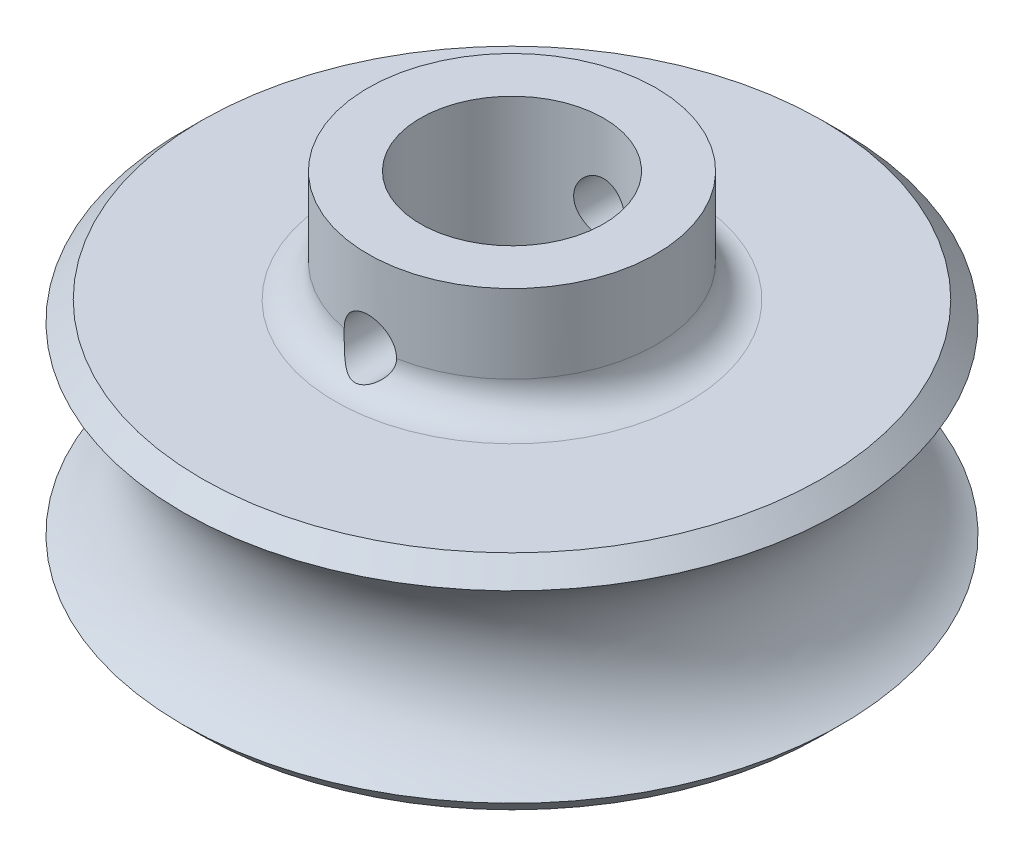
ISO-10303-21;
HEADER;
FILE_DESCRIPTION(('STEP AP214'),'2;1');
FILE_NAME('part.step','',(''),(''),'','','');
FILE_SCHEMA(('AUTOMOTIVE_DESIGN { 1 0 10303 214 1 1 1 1 }'));
ENDSEC;
DATA;
#1=APPLICATION_CONTEXT('core data for automotive mechanical design processes');
#2=APPLICATION_PROTOCOL_DEFINITION('international standard','automotive_design',2000,#1);
#3=PRODUCT_CONTEXT('',#1,'mechanical');
#4=PRODUCT('Part','Part','',(#3));
#5=PRODUCT_RELATED_PRODUCT_CATEGORY('part','',(#4));
#6=PRODUCT_DEFINITION_FORMATION('','',#4);
#7=PRODUCT_DEFINITION_CONTEXT('part definition',#1,'design');
#8=PRODUCT_DEFINITION('design','',#6,#7);
#9=PRODUCT_DEFINITION_SHAPE('','',#8);
#10=(LENGTH_UNIT() NAMED_UNIT(*) SI_UNIT(.MILLI.,.METRE.));
#11=(NAMED_UNIT(*) PLANE_ANGLE_UNIT() SI_UNIT($,.RADIAN.));
#12=(NAMED_UNIT(*) SI_UNIT($,.STERADIAN.) SOLID_ANGLE_UNIT());
#13=UNCERTAINTY_MEASURE_WITH_UNIT(LENGTH_MEASURE(1.E-05),#10,'distance_accuracy_value','');
#14=(GEOMETRIC_REPRESENTATION_CONTEXT(3) GLOBAL_UNCERTAINTY_ASSIGNED_CONTEXT((#13)) GLOBAL_UNIT_ASSIGNED_CONTEXT((#10,
#11,#12)) REPRESENTATION_CONTEXT('',''));
#15=CARTESIAN_POINT('',(0.,0.,0.));
#16=DIRECTION('',(0.,0.,1.));
#17=DIRECTION('',(1.,0.,0.));
#18=AXIS2_PLACEMENT_3D('',#15,#16,#17);
#19=CARTESIAN_POINT('',(0.,0.,0.));
#20=DIRECTION('',(0.,-1.,0.));
#21=DIRECTION('',(0.,0.,-1.));
#22=AXIS2_PLACEMENT_3D('',#19,#20,#21);
#23=CYLINDRICAL_SURFACE('',#22,5.5);
#24=CARTESIAN_POINT('',(0.,12.75,0.));
#25=DIRECTION('',(0.,-1.,0.));
#26=DIRECTION('',(0.,0.,-1.));
#27=AXIS2_PLACEMENT_3D('',#24,#25,#26);
#28=CIRCLE('',#27,5.5);
#29=CARTESIAN_POINT('',(0.,12.75,-5.5));
#30=VERTEX_POINT('',#29);
#31=EDGE_CURVE('E47',#30,#30,#28,.T.);
#32=ORIENTED_EDGE('',*,*,#31,.T.);
#33=EDGE_LOOP('',(#32));
#34=FACE_BOUND('',#33,.T.);
#35=CARTESIAN_POINT('',(0.,9.75,0.));
#36=DIRECTION('',(0.,-1.,0.));
#37=DIRECTION('',(0.,0.,-1.));
#38=AXIS2_PLACEMENT_3D('',#35,#36,#37);
#39=CIRCLE('',#38,5.5);
#40=CARTESIAN_POINT('',(-0.999999999999999,9.75,5.40832691319598));
#41=VERTEX_POINT('',#40);
#42=CARTESIAN_POINT('',(-0.999999999999999,9.75,-5.40832691319598));
#43=VERTEX_POINT('',#42);
#44=EDGE_CURVE('E76',#41,#43,#39,.T.);
#45=ORIENTED_EDGE('',*,*,#44,.F.);
#46=CARTESIAN_POINT('',(0.999999999999999,9.75,5.40832691319598));
#47=CARTESIAN_POINT('',(1.00000009030817,9.7778859691048,5.40832562945698));
#48=CARTESIAN_POINT('',(0.998832820946866,9.80575834618115,5.40854286286805));
#49=CARTESIAN_POINT('',(0.994177925583233,9.86129902142505,5.40940094202984));
#50=CARTESIAN_POINT('',(0.990690555387388,9.88896734175121,5.41004174107959));
#51=CARTESIAN_POINT('',(0.976790488966184,9.97128555123954,5.41257559602071));
#52=CARTESIAN_POINT('',(0.962939684533751,10.0253767122106,5.41508022958945));
#53=CARTESIAN_POINT('',(0.926487701794503,10.1304160550125,5.42143508439629));
#54=CARTESIAN_POINT('',(0.903885013221132,10.1813636926218,5.42528553786427));
#55=CARTESIAN_POINT('',(0.850586549646126,10.2787558493883,5.43389626993413));
#56=CARTESIAN_POINT('',(0.819890351555226,10.3252001329583,5.43865659609615));
#57=CARTESIAN_POINT('',(0.750899154166051,10.4127904453349,5.44861213323576));
#58=CARTESIAN_POINT('',(0.712528634809448,10.4538765174608,5.45381134309448));
#59=CARTESIAN_POINT('',(0.629436745081806,10.5290695096141,5.46402401553731));
#60=CARTESIAN_POINT('',(0.584714398987666,10.5631753554196,5.46903744943435));
#61=CARTESIAN_POINT('',(0.48979537229634,10.6236645615478,5.47835625022638));
#62=CARTESIAN_POINT('',(0.439561930413595,10.6499911219171,5.48265631328071));
#63=CARTESIAN_POINT('',(0.33529686378848,10.6938076331656,5.49001855891895));
#64=CARTESIAN_POINT('',(0.281265745511585,10.7112987598178,5.49308090620072));
#65=CARTESIAN_POINT('',(0.171563063423996,10.7367634703914,5.49759452627017));
#66=CARTESIAN_POINT('',(0.115915877404761,10.7448389684896,5.4990630383731));
#67=CARTESIAN_POINT('',(0.00403706229226314,10.7515606138362,5.50028291001906));
#68=CARTESIAN_POINT('',(-0.0521945334333451,10.7502072965141,5.50003436706766));
#69=CARTESIAN_POINT('',(-0.162944786135762,10.7381879100026,5.49786158911529));
#70=CARTESIAN_POINT('',(-0.217475821363168,10.7276318051556,5.49595714127181));
#71=CARTESIAN_POINT('',(-0.323979098662815,10.6976802655488,5.490708711934));
#72=CARTESIAN_POINT('',(-0.375951268964637,10.6782845830149,5.48736469008846));
#73=CARTESIAN_POINT('',(-0.476183992817319,10.6310980703766,5.47957953321069));
#74=CARTESIAN_POINT('',(-0.524423136915048,10.6032627572284,5.47513260824331));
#75=CARTESIAN_POINT('',(-0.615585330468304,10.5400207528066,5.46563430711896));
#76=CARTESIAN_POINT('',(-0.658508056312163,10.5046136009907,5.46058289420343));
#77=CARTESIAN_POINT('',(-0.738466817295126,10.4266312526263,5.45035022903729));
#78=CARTESIAN_POINT('',(-0.775409845186553,10.3839607499278,5.44516815315131));
#79=CARTESIAN_POINT('',(-0.841638518257556,10.2929651568329,5.43532607241293));
#80=CARTESIAN_POINT('',(-0.870922010956508,10.2446384824515,5.43066621452392));
#81=CARTESIAN_POINT('',(-0.921025025671926,10.1435764914649,5.42239445202536));
#82=CARTESIAN_POINT('',(-0.941826778019894,10.0908321953837,5.41878475203273));
#83=CARTESIAN_POINT('',(-0.974218657398865,9.98255241783262,5.41305580601168));
#84=CARTESIAN_POINT('',(-0.985822528827961,9.92702123335838,5.41093433666704));
#85=CARTESIAN_POINT('',(-0.995105265660945,9.85088182929173,5.4092299618207));
#86=CARTESIAN_POINT('',(-0.996941503261692,9.83073292336642,5.40889165044322));
#87=CARTESIAN_POINT('',(-0.999387297285128,9.79039232218674,5.40844033701008));
#88=CARTESIAN_POINT('',(-0.999998914525635,9.77020075615565,5.40832695643891));
#89=CARTESIAN_POINT('',(-0.999999999999999,9.75,5.40832691319598));
#90=B_SPLINE_CURVE_WITH_KNOTS('',3,(#46,#47,#48,#49,#50,#51,#52,#53,#54,#55,#56,#57,#58,#59,#60,
#61,#62,#63,#64,#65,#66,#67,#68,#69,#70,#71,#72,#73,#74,#75,#76,#77,#78,#79,#80,#81,#82,#83,#84,
#85,#86,#87,#88,#89),.UNSPECIFIED.,.F.,.F.,(4,2,2,2,2,2,2,2,2,2,2,2,2,2,2,2,2,2,2,2,2,4),(0.,
0.0836057779088231,0.167202339254223,0.334016345348504,0.500859150495633,0.66771067910196,
0.836292972456956,1.00490119030739,1.17471168326826,1.3444995727854,1.51243210795578,
1.68035510690119,1.84629867319202,2.01224689117921,2.17908544866572,2.34593415666996,
2.51516998087252,2.68445331271104,2.85408950147355,3.02347172239175,3.08414827484879,
3.14472263337444),.UNSPECIFIED.);
#91=CARTESIAN_POINT('',(0.999999999999999,9.75,5.40832691319598));
#92=VERTEX_POINT('',#91);
#93=EDGE_CURVE('E53',#92,#41,#90,.T.);
#94=ORIENTED_EDGE('',*,*,#93,.F.);
#95=CARTESIAN_POINT('',(0.999999999999999,9.75,-5.40832691319598));
#96=VERTEX_POINT('',#95);
#97=EDGE_CURVE('E77',#96,#92,#39,.T.);
#98=ORIENTED_EDGE('',*,*,#97,.F.);
#99=CARTESIAN_POINT('',(0.999999999999999,9.75,-5.40832691319598));
#100=CARTESIAN_POINT('',(1.00000009030817,9.7778859691048,-5.40832562945698));
#101=CARTESIAN_POINT('',(0.998832820946866,9.80575834618115,-5.40854286286805));
#102=CARTESIAN_POINT('',(0.994177925583233,9.86129902142505,-5.40940094202984));
#103=CARTESIAN_POINT('',(0.990690555387388,9.88896734175121,-5.41004174107959));
#104=CARTESIAN_POINT('',(0.976790488966184,9.97128555123954,-5.41257559602071));
#105=CARTESIAN_POINT('',(0.962939684533751,10.0253767122106,-5.41508022958945));
#106=CARTESIAN_POINT('',(0.926487701794503,10.1304160550125,-5.42143508439629));
#107=CARTESIAN_POINT('',(0.903885013221132,10.1813636926218,-5.42528553786427));
#108=CARTESIAN_POINT('',(0.850586549646126,10.2787558493883,-5.43389626993413));
#109=CARTESIAN_POINT('',(0.819890351555226,10.3252001329583,-5.43865659609615));
#110=CARTESIAN_POINT('',(0.750899154166051,10.4127904453349,-5.44861213323576));
#111=CARTESIAN_POINT('',(0.712528634809448,10.4538765174608,-5.45381134309448));
#112=CARTESIAN_POINT('',(0.629436745081806,10.5290695096141,-5.46402401553731));
#113=CARTESIAN_POINT('',(0.584714398987666,10.5631753554196,-5.46903744943435));
#114=CARTESIAN_POINT('',(0.48979537229634,10.6236645615478,-5.47835625022638));
#115=CARTESIAN_POINT('',(0.439561930413595,10.6499911219171,-5.48265631328071));
#116=CARTESIAN_POINT('',(0.33529686378848,10.6938076331656,-5.49001855891895));
#117=CARTESIAN_POINT('',(0.281265745511585,10.7112987598178,-5.49308090620072));
#118=CARTESIAN_POINT('',(0.171563063423996,10.7367634703914,-5.49759452627017));
#119=CARTESIAN_POINT('',(0.115915877404761,10.7448389684896,-5.4990630383731));
#120=CARTESIAN_POINT('',(0.00403706229226314,10.7515606138362,-5.50028291001906));
#121=CARTESIAN_POINT('',(-0.0521945334333451,10.7502072965141,-5.50003436706766));
#122=CARTESIAN_POINT('',(-0.162944786135762,10.7381879100026,-5.49786158911529));
#123=CARTESIAN_POINT('',(-0.217475821363168,10.7276318051556,-5.49595714127181));
#124=CARTESIAN_POINT('',(-0.323979098662815,10.6976802655488,-5.490708711934));
#125=CARTESIAN_POINT('',(-0.375951268964637,10.6782845830149,-5.48736469008846));
#126=CARTESIAN_POINT('',(-0.476183992817319,10.6310980703766,-5.47957953321069));
#127=CARTESIAN_POINT('',(-0.524423136915048,10.6032627572284,-5.47513260824331));
#128=CARTESIAN_POINT('',(-0.615585330468304,10.5400207528066,-5.46563430711896));
#129=CARTESIAN_POINT('',(-0.658508056312163,10.5046136009907,-5.46058289420343));
#130=CARTESIAN_POINT('',(-0.738466817295126,10.4266312526263,-5.45035022903729));
#131=CARTESIAN_POINT('',(-0.775409845186553,10.3839607499278,-5.44516815315131));
#132=CARTESIAN_POINT('',(-0.841638518257556,10.2929651568329,-5.43532607241293));
#133=CARTESIAN_POINT('',(-0.870922010956508,10.2446384824515,-5.43066621452392));
#134=CARTESIAN_POINT('',(-0.921025025671926,10.1435764914649,-5.42239445202536));
#135=CARTESIAN_POINT('',(-0.941826778019894,10.0908321953837,-5.41878475203273));
#136=CARTESIAN_POINT('',(-0.974218657398865,9.98255241783262,-5.41305580601168));
#137=CARTESIAN_POINT('',(-0.985822528827961,9.92702123335838,-5.41093433666704));
#138=CARTESIAN_POINT('',(-0.995105265660945,9.85088182929173,-5.4092299618207));
#139=CARTESIAN_POINT('',(-0.996941503261692,9.83073292336642,-5.40889165044322));
#140=CARTESIAN_POINT('',(-0.999387297285128,9.79039232218674,-5.40844033701008));
#141=CARTESIAN_POINT('',(-0.999998914525635,9.77020075615565,-5.40832695643891));
#142=CARTESIAN_POINT('',(-0.999999999999999,9.75,-5.40832691319598));
#143=B_SPLINE_CURVE_WITH_KNOTS('',3,(#99,#100,#101,#102,#103,#104,#105,#106,#107,#108,#109,#110,
#111,#112,#113,#114,#115,#116,#117,#118,#119,#120,#121,#122,#123,#124,#125,#126,#127,#128,#129,
#130,#131,#132,#133,#134,#135,#136,#137,#138,#139,#140,#141,#142),.UNSPECIFIED.,.F.,.F.,(4,2,2,
2,2,2,2,2,2,2,2,2,2,2,2,2,2,2,2,2,2,4),(0.,0.0836057779088231,0.167202339254223,
0.334016345348504,0.500859150495633,0.66771067910196,0.836292972456956,1.00490119030739,
1.17471168326826,1.3444995727854,1.51243210795578,1.68035510690119,1.84629867319202,
2.01224689117921,2.17908544866572,2.34593415666996,2.51516998087252,2.68445331271104,
2.85408950147355,3.02347172239175,3.08414827484879,3.14472263337444),.UNSPECIFIED.);
#144=EDGE_CURVE('E60',#96,#43,#143,.T.);
#145=ORIENTED_EDGE('',*,*,#144,.T.);
#146=EDGE_LOOP('',(#45,#94,#98,#145));
#147=FACE_BOUND('',#146,.T.);
#148=ADVANCED_FACE('F39',(#34,#147),#23,.T.);
#149=CARTESIAN_POINT('',(0.,9.75,0.));
#150=DIRECTION('',(0.,-1.,0.));
#151=DIRECTION('',(0.,0.,-1.));
#152=AXIS2_PLACEMENT_3D('',#149,#150,#151);
#153=TOROIDAL_SURFACE('',#152,6.75,1.25);
#154=CARTESIAN_POINT('',(0.,8.5,0.));
#155=DIRECTION('',(0.,-1.,0.));
#156=DIRECTION('',(0.,0.,-1.));
#157=AXIS2_PLACEMENT_3D('',#154,#155,#156);
#158=CIRCLE('',#157,6.75000000000001);
#159=CARTESIAN_POINT('',(0.,8.5,-6.75000000000001));
#160=VERTEX_POINT('',#159);
#161=EDGE_CURVE('E81',#160,#160,#158,.T.);
#162=ORIENTED_EDGE('',*,*,#161,.F.);
#163=EDGE_LOOP('',(#162));
#164=FACE_BOUND('',#163,.T.);
#165=ORIENTED_EDGE('',*,*,#97,.T.);
#166=CARTESIAN_POINT('',(-0.999999979999999,9.7502,5.40832693316519));
#167=CARTESIAN_POINT('',(-1.00000804252328,9.72719282060409,5.40831716112023));
#168=CARTESIAN_POINT('',(-0.999214543692224,9.70420051890534,5.40911130242994));
#169=CARTESIAN_POINT('',(-0.996063894667847,9.65845336278462,5.41225378366538));
#170=CARTESIAN_POINT('',(-0.993708350714648,9.63569828881167,5.41460052705546));
#171=CARTESIAN_POINT('',(-0.984422793562111,9.56851753890539,5.42382479605642));
#172=CARTESIAN_POINT('',(-0.975272000739172,9.52467045620834,5.43288878419799));
#173=CARTESIAN_POINT('',(-0.95175647118763,9.4400153978229,5.45589383439415));
#174=CARTESIAN_POINT('',(-0.937411068101134,9.39919682049256,5.46981680509556));
#175=CARTESIAN_POINT('',(-0.904256897501496,9.32089349259112,5.50144826876456));
#176=CARTESIAN_POINT('',(-0.885436343356276,9.28341791143067,5.51916674589296));
#177=CARTESIAN_POINT('',(-0.834242793929427,9.19526605371771,5.56630488403472));
#178=CARTESIAN_POINT('',(-0.799667154794878,9.14671426622422,5.59729869199267));
#179=CARTESIAN_POINT('',(-0.723702401200159,9.05739018921767,5.66220652737461));
#180=CARTESIAN_POINT('',(-0.682292762097163,9.01664215856126,5.69612920010944));
#181=CARTESIAN_POINT('',(-0.591992847000035,8.94186535645848,5.76505146814543));
#182=CARTESIAN_POINT('',(-0.542928830828048,8.90805104330878,5.80005512440473));
#183=CARTESIAN_POINT('',(-0.437862986192615,8.84894939049862,5.8665987273746));
#184=CARTESIAN_POINT('',(-0.381889551654756,8.82362864433928,5.89815190701963));
#185=CARTESIAN_POINT('',(-0.290702538253699,8.79261613831311,5.93911548319774));
#186=CARTESIAN_POINT('',(-0.258263574497984,8.78331449701083,5.95192293439957));
#187=CARTESIAN_POINT('',(-0.191397416366904,8.76788972013017,5.97365411472861));
#188=CARTESIAN_POINT('',(-0.15697422953077,8.76176041122614,5.98258538135734));
#189=CARTESIAN_POINT('',(-0.0862759397620696,8.75308734887237,5.99534932448606));
#190=CARTESIAN_POINT('',(-0.0499838456372321,8.75058651377569,5.99912094224791));
#191=CARTESIAN_POINT('',(0.0227803230717569,8.74959850246273,6.00060156598637));
#192=CARTESIAN_POINT('',(0.0592523435386831,8.75111018505702,5.99831229572442));
#193=CARTESIAN_POINT('',(0.126464816649703,8.75752642745818,5.98880243803298));
#194=CARTESIAN_POINT('',(0.157349145311836,8.7619802814325,5.98223837894839));
#195=CARTESIAN_POINT('',(0.217680325446654,8.77349613816694,5.96570548397403));
#196=CARTESIAN_POINT('',(0.24712572910409,8.78056070899005,5.95573329636639));
#197=CARTESIAN_POINT('',(0.325383750442883,8.80300637149467,5.92508197801238));
#198=CARTESIAN_POINT('',(0.372551520786204,8.82068601129623,5.90191594927177));
#199=CARTESIAN_POINT('',(0.46220254077828,8.86184714494802,5.8518503931254));
#200=CARTESIAN_POINT('',(0.50466616456708,8.88535171212234,5.82493620912733));
#201=CARTESIAN_POINT('',(0.598885372136318,8.94658309210895,5.76045615388502));
#202=CARTESIAN_POINT('',(0.648915933321861,8.98643051296072,5.72237043199424));
#203=CARTESIAN_POINT('',(0.741120584004653,9.07558529642981,5.64793454288323));
#204=CARTESIAN_POINT('',(0.783309270547531,9.12487472887451,5.61158124666065));
#205=CARTESIAN_POINT('',(0.847200377095192,9.21674643130092,5.5544943424002));
#206=CARTESIAN_POINT('',(0.871236473419657,9.25683411132357,5.53236598446782));
#207=CARTESIAN_POINT('',(0.914049557893181,9.34163729199806,5.49222746288336));
#208=CARTESIAN_POINT('',(0.932834094865658,9.38634602211056,5.47421139495753));
#209=CARTESIAN_POINT('',(0.961269330104571,9.47143223362747,5.44663242499002));
#210=CARTESIAN_POINT('',(0.971951652988446,9.51115950868585,5.43613487179779));
#211=CARTESIAN_POINT('',(0.988390297690383,9.59253318329813,5.41990110655106));
#212=CARTESIAN_POINT('',(0.99415812101718,9.63417486025302,5.41415377839418));
#213=CARTESIAN_POINT('',(0.998181410178925,9.68845487485705,5.41014184428294));
#214=CARTESIAN_POINT('',(0.998865152120111,9.70078774544514,5.40945966979976));
#215=CARTESIAN_POINT('',(0.999775230117947,9.72547879182449,5.40855142981916));
#216=CARTESIAN_POINT('',(1.00000187360063,9.73783694500847,5.40832505776754));
#217=CARTESIAN_POINT('',(0.99999998,9.7502,5.40832693316519));
#218=B_SPLINE_CURVE_WITH_KNOTS('',3,(#166,#167,#168,#169,#170,#171,#172,#173,#174,#175,#176,
#177,#178,#179,#180,#181,#182,#183,#184,#185,#186,#187,#188,#189,#190,#191,#192,#193,#194,#195,
#196,#197,#198,#199,#200,#201,#202,#203,#204,#205,#206,#207,#208,#209,#210,#211,#212,#213,#214,
#215,#216,#217),.UNSPECIFIED.,.F.,.F.,(4,2,2,2,2,2,2,2,2,2,2,2,2,2,2,2,2,2,2,2,2,2,2,2,2,4),(0.,
0.0689655450051103,0.13786028296059,0.274156926431125,0.409951420046571,0.546107609432229,
0.746567920714044,0.947641615066327,1.15421930603202,1.35997469829515,1.46795477823485,
1.57572393244619,1.68475769385673,1.7937604485894,1.88905185465507,1.98443724584613,
2.14982149700748,2.31587163259893,2.53817045758408,2.76005125331902,2.91468639607107,
3.06909810295839,3.19596307978642,3.32253032983455,3.35963030642354,3.39670532272918),.UNSPECIFIED.);
#219=EDGE_CURVE('E80',#41,#92,#218,.T.);
#220=ORIENTED_EDGE('',*,*,#219,.F.);
#221=ORIENTED_EDGE('',*,*,#44,.T.);
#222=CARTESIAN_POINT('',(-0.999999979999999,9.7502,-5.40832693316519));
#223=CARTESIAN_POINT('',(-1.00000804252328,9.72719282060409,-5.40831716112023));
#224=CARTESIAN_POINT('',(-0.999214543692224,9.70420051890534,-5.40911130242994));
#225=CARTESIAN_POINT('',(-0.996063894667847,9.65845336278462,-5.41225378366538));
#226=CARTESIAN_POINT('',(-0.993708350714648,9.63569828881167,-5.41460052705546));
#227=CARTESIAN_POINT('',(-0.984422793562111,9.56851753890539,-5.42382479605642));
#228=CARTESIAN_POINT('',(-0.975272000739172,9.52467045620834,-5.43288878419799));
#229=CARTESIAN_POINT('',(-0.95175647118763,9.4400153978229,-5.45589383439415));
#230=CARTESIAN_POINT('',(-0.937411068101134,9.39919682049256,-5.46981680509556));
#231=CARTESIAN_POINT('',(-0.904256897501496,9.32089349259112,-5.50144826876456));
#232=CARTESIAN_POINT('',(-0.885436343356276,9.28341791143067,-5.51916674589296));
#233=CARTESIAN_POINT('',(-0.834242793929427,9.19526605371771,-5.56630488403472));
#234=CARTESIAN_POINT('',(-0.799667154794878,9.14671426622422,-5.59729869199267));
#235=CARTESIAN_POINT('',(-0.723702401200159,9.05739018921767,-5.66220652737461));
#236=CARTESIAN_POINT('',(-0.682292762097163,9.01664215856126,-5.69612920010944));
#237=CARTESIAN_POINT('',(-0.591992847000035,8.94186535645848,-5.76505146814543));
#238=CARTESIAN_POINT('',(-0.542928830828048,8.90805104330878,-5.80005512440473));
#239=CARTESIAN_POINT('',(-0.437862986192615,8.84894939049862,-5.8665987273746));
#240=CARTESIAN_POINT('',(-0.381889551654756,8.82362864433928,-5.89815190701963));
#241=CARTESIAN_POINT('',(-0.290702538253699,8.79261613831311,-5.93911548319774));
#242=CARTESIAN_POINT('',(-0.258263574497984,8.78331449701083,-5.95192293439957));
#243=CARTESIAN_POINT('',(-0.191397416366904,8.76788972013017,-5.97365411472861));
#244=CARTESIAN_POINT('',(-0.15697422953077,8.76176041122614,-5.98258538135734));
#245=CARTESIAN_POINT('',(-0.0862759397620696,8.75308734887237,-5.99534932448606));
#246=CARTESIAN_POINT('',(-0.0499838456372321,8.75058651377569,-5.99912094224791));
#247=CARTESIAN_POINT('',(0.0227803230717569,8.74959850246273,-6.00060156598637));
#248=CARTESIAN_POINT('',(0.0592523435386831,8.75111018505702,-5.99831229572442));
#249=CARTESIAN_POINT('',(0.126464816649703,8.75752642745818,-5.98880243803298));
#250=CARTESIAN_POINT('',(0.157349145311836,8.7619802814325,-5.98223837894839));
#251=CARTESIAN_POINT('',(0.217680325446654,8.77349613816694,-5.96570548397403));
#252=CARTESIAN_POINT('',(0.24712572910409,8.78056070899005,-5.95573329636639));
#253=CARTESIAN_POINT('',(0.325383750442883,8.80300637149467,-5.92508197801238));
#254=CARTESIAN_POINT('',(0.372551520786204,8.82068601129623,-5.90191594927177));
#255=CARTESIAN_POINT('',(0.46220254077828,8.86184714494802,-5.8518503931254));
#256=CARTESIAN_POINT('',(0.50466616456708,8.88535171212234,-5.82493620912733));
#257=CARTESIAN_POINT('',(0.598885372136318,8.94658309210895,-5.76045615388502));
#258=CARTESIAN_POINT('',(0.648915933321861,8.98643051296072,-5.72237043199424));
#259=CARTESIAN_POINT('',(0.741120584004653,9.07558529642981,-5.64793454288323));
#260=CARTESIAN_POINT('',(0.783309270547531,9.12487472887451,-5.61158124666065));
#261=CARTESIAN_POINT('',(0.847200377095192,9.21674643130092,-5.5544943424002));
#262=CARTESIAN_POINT('',(0.871236473419657,9.25683411132357,-5.53236598446782));
#263=CARTESIAN_POINT('',(0.914049557893181,9.34163729199806,-5.49222746288336));
#264=CARTESIAN_POINT('',(0.932834094865658,9.38634602211056,-5.47421139495753));
#265=CARTESIAN_POINT('',(0.961269330104571,9.47143223362747,-5.44663242499002));
#266=CARTESIAN_POINT('',(0.971951652988446,9.51115950868585,-5.43613487179779));
#267=CARTESIAN_POINT('',(0.988390297690383,9.59253318329813,-5.41990110655106));
#268=CARTESIAN_POINT('',(0.99415812101718,9.63417486025302,-5.41415377839418));
#269=CARTESIAN_POINT('',(0.998181410178925,9.68845487485705,-5.41014184428294));
#270=CARTESIAN_POINT('',(0.998865152120111,9.70078774544514,-5.40945966979976));
#271=CARTESIAN_POINT('',(0.999775230117947,9.72547879182449,-5.40855142981916));
#272=CARTESIAN_POINT('',(1.00000187360063,9.73783694500847,-5.40832505776754));
#273=CARTESIAN_POINT('',(0.99999998,9.7502,-5.40832693316519));
#274=B_SPLINE_CURVE_WITH_KNOTS('',3,(#222,#223,#224,#225,#226,#227,#228,#229,#230,#231,#232,
#233,#234,#235,#236,#237,#238,#239,#240,#241,#242,#243,#244,#245,#246,#247,#248,#249,#250,#251,
#252,#253,#254,#255,#256,#257,#258,#259,#260,#261,#262,#263,#264,#265,#266,#267,#268,#269,#270,
#271,#272,#273),.UNSPECIFIED.,.F.,.F.,(4,2,2,2,2,2,2,2,2,2,2,2,2,2,2,2,2,2,2,2,2,2,2,2,2,4),(0.,
0.0689655450051103,0.13786028296059,0.274156926431125,0.409951420046571,0.546107609432229,
0.746567920714044,0.947641615066327,1.15421930603202,1.35997469829515,1.46795477823485,
1.57572393244619,1.68475769385673,1.7937604485894,1.88905185465507,1.98443724584613,
2.14982149700748,2.31587163259893,2.53817045758408,2.76005125331902,2.91468639607107,
3.06909810295839,3.19596307978642,3.32253032983455,3.35963030642354,3.39670532272918),.UNSPECIFIED.);
#275=EDGE_CURVE('E65',#43,#96,#274,.T.);
#276=ORIENTED_EDGE('',*,*,#275,.T.);
#277=EDGE_LOOP('',(#165,#220,#221,#276));
#278=FACE_BOUND('',#277,.T.);
#279=ADVANCED_FACE('F79',(#164,#278),#153,.F.);
#280=CARTESIAN_POINT('',(0.,0.,0.));
#281=DIRECTION('',(0.,-1.,0.));
#282=DIRECTION('',(0.,0.,-1.));
#283=AXIS2_PLACEMENT_3D('',#280,#281,#282);
#284=CYLINDRICAL_SURFACE('',#283,3.5);
#285=CARTESIAN_POINT('',(0.,12.75,0.));
#286=DIRECTION('',(0.,-1.,0.));
#287=DIRECTION('',(0.,0.,-1.));
#288=AXIS2_PLACEMENT_3D('',#285,#286,#287);
#289=CIRCLE('',#288,3.5);
#290=CARTESIAN_POINT('',(0.,12.75,-3.5));
#291=VERTEX_POINT('',#290);
#292=EDGE_CURVE('E11',#291,#291,#289,.T.);
#293=ORIENTED_EDGE('',*,*,#292,.F.);
#294=EDGE_LOOP('',(#293));
#295=FACE_BOUND('',#294,.T.);
#296=CARTESIAN_POINT('',(0.,0.,0.));
#297=DIRECTION('',(0.,-1.,0.));
#298=DIRECTION('',(0.,0.,-1.));
#299=AXIS2_PLACEMENT_3D('',#296,#297,#298);
#300=CIRCLE('',#299,3.5);
#301=CARTESIAN_POINT('',(0.,0.,-3.5));
#302=VERTEX_POINT('',#301);
#303=EDGE_CURVE('E142',#302,#302,#300,.T.);
#304=ORIENTED_EDGE('',*,*,#303,.T.);
#305=EDGE_LOOP('',(#304));
#306=FACE_BOUND('',#305,.T.);
#307=CARTESIAN_POINT('',(0.999999999999999,9.75,-3.35410196624969));
#308=CARTESIAN_POINT('',(0.999999010234616,9.69507423107725,-3.3541027352982));
#309=CARTESIAN_POINT('',(0.995459333009391,9.64013845792023,-3.35546589937234));
#310=CARTESIAN_POINT('',(0.977461816962147,9.53186438061245,-3.36075194701915));
#311=CARTESIAN_POINT('',(0.964000350683298,9.47852673545843,-3.36467587174621));
#312=CARTESIAN_POINT('',(0.928646716460408,9.3750313995488,-3.37460354734502));
#313=CARTESIAN_POINT('',(0.906767603258317,9.32486892408729,-3.38060407621639));
#314=CARTESIAN_POINT('',(0.855241820315738,9.22891609422696,-3.3940046055512));
#315=CARTESIAN_POINT('',(0.825594228332017,9.18312625981211,-3.40140477214508));
#316=CARTESIAN_POINT('',(0.7584624004907,9.09590421734143,-3.41700891605117));
#317=CARTESIAN_POINT('',(0.720794605566167,9.05461609893508,-3.42522877981549));
#318=CARTESIAN_POINT('',(0.639085622734712,8.97884860834842,-3.44140982756535));
#319=CARTESIAN_POINT('',(0.595043689579836,8.94437003343867,-3.44937098116968));
#320=CARTESIAN_POINT('',(0.500823016078772,8.88258567582316,-3.46431666000612));
#321=CARTESIAN_POINT('',(0.450545391880927,8.85542519012449,-3.47128027250395));
#322=CARTESIAN_POINT('',(0.345904237619825,8.80999911279204,-3.48326270242804));
#323=CARTESIAN_POINT('',(0.291541505437587,8.79173178937988,-3.48828189845443));
#324=CARTESIAN_POINT('',(0.181779287560586,8.76508276938014,-3.49569759650108));
#325=CARTESIAN_POINT('',(0.126443899064519,8.75645548914767,-3.49815913505649));
#326=CARTESIAN_POINT('',(0.0150600512109614,8.74855663305839,-3.50041047829849));
#327=CARTESIAN_POINT('',(-0.040988269794275,8.74928326883133,-3.50020079369491));
#328=CARTESIAN_POINT('',(-0.150490097867611,8.75990318745902,-3.49718003381653));
#329=CARTESIAN_POINT('',(-0.203971773054474,8.769530806319,-3.49444435388027));
#330=CARTESIAN_POINT('',(-0.308526111088809,8.79724755123219,-3.48676943165067));
#331=CARTESIAN_POINT('',(-0.359598627150255,8.81533719213106,-3.48183005528105));
#332=CARTESIAN_POINT('',(-0.458536916864462,8.85965470040591,-3.47019515886062));
#333=CARTESIAN_POINT('',(-0.506361521925386,8.88596938890417,-3.46348102756093));
#334=CARTESIAN_POINT('',(-0.597003621795241,8.94592229319901,-3.44901384486994));
#335=CARTESIAN_POINT('',(-0.639820016208004,8.97956211383323,-3.44126056595877));
#336=CARTESIAN_POINT('',(-0.720816324273876,9.05460285530931,-3.42522841509913));
#337=CARTESIAN_POINT('',(-0.758780788792452,9.09623471680256,-3.41694064685079));
#338=CARTESIAN_POINT('',(-0.827246507874875,9.18535754592295,-3.4010148689311));
#339=CARTESIAN_POINT('',(-0.857747156891286,9.23284898847439,-3.39337691201241));
#340=CARTESIAN_POINT('',(-0.910616679927254,9.33286544224911,-3.37957587408658));
#341=CARTESIAN_POINT('',(-0.932918688943923,9.38542761252626,-3.37342505474767));
#342=CARTESIAN_POINT('',(-0.968294757480378,9.49377658175188,-3.36344272188227));
#343=CARTESIAN_POINT('',(-0.981371502013289,9.54956243732834,-3.35961053356453));
#344=CARTESIAN_POINT('',(-0.997537085998825,9.66074021216189,-3.35484557617748));
#345=CARTESIAN_POINT('',(-1.00095074078696,9.71608090846044,-3.35381855730448));
#346=CARTESIAN_POINT('',(-0.998594983598453,9.82654415795747,-3.35452079870229));
#347=CARTESIAN_POINT('',(-0.992826717122483,9.88166673750731,-3.35624971515342));
#348=CARTESIAN_POINT('',(-0.972558907129287,9.98882061401528,-3.36217715008271));
#349=CARTESIAN_POINT('',(-0.958262310920606,10.0408937930086,-3.3663182147774));
#350=CARTESIAN_POINT('',(-0.921575809332239,10.1419009359978,-3.37654531970352));
#351=CARTESIAN_POINT('',(-0.899184736133864,10.1908344458225,-3.38263164056921));
#352=CARTESIAN_POINT('',(-0.846309825608089,10.2855110376087,-3.3962509400331));
#353=CARTESIAN_POINT('',(-0.815639458645648,10.3311452221012,-3.4038159869019));
#354=CARTESIAN_POINT('',(-0.747302318424212,10.4167381867216,-3.41946863275287));
#355=CARTESIAN_POINT('',(-0.709634028840684,10.456695733506,-3.42755634473907));
#356=CARTESIAN_POINT('',(-0.626854004982774,10.5311897091441,-3.44367363717939));
#357=CARTESIAN_POINT('',(-0.58153385512027,10.5654974857094,-3.45169203023044));
#358=CARTESIAN_POINT('',(-0.48559265352877,10.6260228406914,-3.46648988523027));
#359=CARTESIAN_POINT('',(-0.434971879049089,10.6522408419612,-3.47326941192714));
#360=CARTESIAN_POINT('',(-0.33021663647808,10.6955921435132,-3.48478252423196));
#361=CARTESIAN_POINT('',(-0.276112399949815,10.7127941947931,-3.48953154063622));
#362=CARTESIAN_POINT('',(-0.16562282427496,10.7378134009701,-3.49651669811945));
#363=CARTESIAN_POINT('',(-0.109238075792717,10.7456329700907,-3.4987534856151));
#364=CARTESIAN_POINT('',(0.00208911897951606,10.7514957169989,-3.50042667501642));
#365=CARTESIAN_POINT('',(0.0570128155249797,10.7498720745414,-3.49995851794498));
#366=CARTESIAN_POINT('',(0.165772586211003,10.7376808592949,-3.49649534561067));
#367=CARTESIAN_POINT('',(0.219608712308766,10.727113714809,-3.49350045135296));
#368=CARTESIAN_POINT('',(0.324202066519794,10.6975343195106,-3.48534400930059));
#369=CARTESIAN_POINT('',(0.374982516717526,10.678598410528,-3.4802020702409));
#370=CARTESIAN_POINT('',(0.472673601380731,10.6328869208573,-3.46828547071724));
#371=CARTESIAN_POINT('',(0.51958363529034,10.6061101264539,-3.46151055750883));
#372=CARTESIAN_POINT('',(0.609716728176956,10.5445513312876,-3.44679477720104));
#373=CARTESIAN_POINT('',(0.652788664003539,10.5095549566058,-3.43882522893152));
#374=CARTESIAN_POINT('',(0.732560611159189,10.432945437273,-3.42272032493228));
#375=CARTESIAN_POINT('',(0.769258856094888,10.3913304644575,-3.4145849239342));
#376=CARTESIAN_POINT('',(0.836204230145643,10.3013515415023,-3.39882018772077));
#377=CARTESIAN_POINT('',(0.866256583618024,10.2528390262484,-3.39120975884781));
#378=CARTESIAN_POINT('',(0.917739718098038,10.1512390673425,-3.37764222665284));
#379=CARTESIAN_POINT('',(0.939175324424088,10.0981542044552,-3.37168419857914));
#380=CARTESIAN_POINT('',(0.97049267006252,9.99617314988425,-3.36279229780034));
#381=CARTESIAN_POINT('',(0.981529499909263,9.94765482595075,-3.3595621942308));
#382=CARTESIAN_POINT('',(0.996283035217828,9.84942694082203,-3.35521684727178));
#383=CARTESIAN_POINT('',(1.00000089591333,9.799717568877,-3.35410127012429));
#384=CARTESIAN_POINT('',(0.999999999999999,9.75,-3.35410196624969));
#385=B_SPLINE_CURVE_WITH_KNOTS('',3,(#307,#308,#309,#310,#311,#312,#313,#314,#315,#316,#317,
#318,#319,#320,#321,#322,#323,#324,#325,#326,#327,#328,#329,#330,#331,#332,#333,#334,#335,#336,
#337,#338,#339,#340,#341,#342,#343,#344,#345,#346,#347,#348,#349,#350,#351,#352,#353,#354,#355,
#356,#357,#358,#359,#360,#361,#362,#363,#364,#365,#366,#367,#368,#369,#370,#371,#372,#373,#374,
#375,#376,#377,#378,#379,#380,#381,#382,#383,#384),.UNSPECIFIED.,.T.,.F.,(4,2,2,2,2,2,2,2,2,2,2,
2,2,2,2,2,2,2,2,2,2,2,2,2,2,2,2,2,2,2,2,2,2,2,2,2,2,2,4),(0.,0.164594171159104,0.32925530476515,
0.49366209182394,0.658088405459393,0.826785835988801,0.995503006148133,1.16735741502495,
1.33917834504425,1.50651450509943,1.67381867271781,1.83628518817282,1.99876158968833,
2.16301451684817,2.32730346587989,2.49735806342072,2.66742645310451,2.83885260310574,
3.01022883892077,3.17577181660545,3.34129414341278,3.50302644820309,3.66478209600073,
3.83054003013244,3.99633392302106,4.16772694180381,4.33911100034377,4.50916842641098,
4.67918208530372,4.84323448834083,5.0072790353734,5.16985706186658,5.33246026763665,
5.49989884364739,5.6673837494971,5.83926806202706,6.01105598599878,6.16006644425299,
6.30905338065553),.UNSPECIFIED.);
#386=CARTESIAN_POINT('',(0.999999999999999,9.75,-3.35410196624969));
#387=VERTEX_POINT('',#386);
#388=EDGE_CURVE('E72',#387,#387,#385,.T.);
#389=ORIENTED_EDGE('',*,*,#388,.T.);
#390=EDGE_LOOP('',(#389));
#391=FACE_BOUND('',#390,.T.);
#392=CARTESIAN_POINT('',(-0.999999999999999,9.75,3.35410196624969));
#393=CARTESIAN_POINT('',(-0.999999010234616,9.80492576892275,3.3541027352982));
#394=CARTESIAN_POINT('',(-0.995459333009391,9.85986154207977,3.35546589937234));
#395=CARTESIAN_POINT('',(-0.977461816962147,9.96813561938756,3.36075194701915));
#396=CARTESIAN_POINT('',(-0.964000350683297,10.0214732645416,3.36467587174621));
#397=CARTESIAN_POINT('',(-0.928646716460408,10.1249686004512,3.37460354734502));
#398=CARTESIAN_POINT('',(-0.906767603258318,10.1751310759127,3.38060407621639));
#399=CARTESIAN_POINT('',(-0.855241820315739,10.271083905773,3.3940046055512));
#400=CARTESIAN_POINT('',(-0.825594228332017,10.3168737401879,3.40140477214508));
#401=CARTESIAN_POINT('',(-0.7584624004907,10.4040957826586,3.41700891605117));
#402=CARTESIAN_POINT('',(-0.720794605566167,10.4453839010649,3.42522877981549));
#403=CARTESIAN_POINT('',(-0.639085622734712,10.5211513916516,3.44140982756535));
#404=CARTESIAN_POINT('',(-0.595043689579836,10.5556299665613,3.44937098116968));
#405=CARTESIAN_POINT('',(-0.500823016078773,10.6174143241768,3.46431666000612));
#406=CARTESIAN_POINT('',(-0.450545391880927,10.6445748098755,3.47128027250395));
#407=CARTESIAN_POINT('',(-0.345904237619825,10.690000887208,3.48326270242804));
#408=CARTESIAN_POINT('',(-0.291541505437587,10.7082682106201,3.48828189845443));
#409=CARTESIAN_POINT('',(-0.181779287560586,10.7349172306199,3.49569759650108));
#410=CARTESIAN_POINT('',(-0.126443899064519,10.7435445108523,3.49815913505649));
#411=CARTESIAN_POINT('',(-0.0150600512109614,10.7514433669416,3.50041047829849));
#412=CARTESIAN_POINT('',(0.040988269794275,10.7507167311687,3.50020079369491));
#413=CARTESIAN_POINT('',(0.150490097867611,10.740096812541,3.49718003381653));
#414=CARTESIAN_POINT('',(0.203971773054474,10.730469193681,3.49444435388027));
#415=CARTESIAN_POINT('',(0.308526111088809,10.7027524487678,3.48676943165067));
#416=CARTESIAN_POINT('',(0.359598627150255,10.6846628078689,3.48183005528105));
#417=CARTESIAN_POINT('',(0.458536916864462,10.6403452995941,3.47019515886062));
#418=CARTESIAN_POINT('',(0.506361521925386,10.6140306110958,3.46348102756093));
#419=CARTESIAN_POINT('',(0.597003621795241,10.554077706801,3.44901384486994));
#420=CARTESIAN_POINT('',(0.639820016208004,10.5204378861668,3.44126056595877));
#421=CARTESIAN_POINT('',(0.720816324273876,10.4453971446907,3.42522841509913));
#422=CARTESIAN_POINT('',(0.758780788792452,10.4037652831974,3.41694064685079));
#423=CARTESIAN_POINT('',(0.827246507874875,10.3146424540771,3.4010148689311));
#424=CARTESIAN_POINT('',(0.857747156891286,10.2671510115256,3.39337691201241));
#425=CARTESIAN_POINT('',(0.910616679927253,10.1671345577509,3.37957587408658));
#426=CARTESIAN_POINT('',(0.932918688943923,10.1145723874737,3.37342505474767));
#427=CARTESIAN_POINT('',(0.968294757480378,10.0062234182481,3.36344272188227));
#428=CARTESIAN_POINT('',(0.981371502013288,9.95043756267166,3.35961053356453));
#429=CARTESIAN_POINT('',(0.997537085998825,9.83925978783811,3.35484557617748));
#430=CARTESIAN_POINT('',(1.00095074078696,9.78391909153957,3.35381855730448));
#431=CARTESIAN_POINT('',(0.998594983598453,9.67345584204254,3.35452079870229));
#432=CARTESIAN_POINT('',(0.992826717122483,9.6183332624927,3.35624971515342));
#433=CARTESIAN_POINT('',(0.972558907129287,9.51117938598472,3.36217715008271));
#434=CARTESIAN_POINT('',(0.958262310920606,9.4591062069914,3.3663182147774));
#435=CARTESIAN_POINT('',(0.921575809332239,9.35809906400215,3.37654531970352));
#436=CARTESIAN_POINT('',(0.899184736133864,9.30916555417745,3.38263164056921));
#437=CARTESIAN_POINT('',(0.846309825608089,9.21448896239134,3.3962509400331));
#438=CARTESIAN_POINT('',(0.815639458645648,9.16885477789883,3.4038159869019));
#439=CARTESIAN_POINT('',(0.747302318424212,9.0832618132784,3.41946863275287));
#440=CARTESIAN_POINT('',(0.709634028840684,9.04330426649395,3.42755634473907));
#441=CARTESIAN_POINT('',(0.626854004982774,8.96881029085589,3.44367363717939));
#442=CARTESIAN_POINT('',(0.58153385512027,8.93450251429063,3.45169203023044));
#443=CARTESIAN_POINT('',(0.48559265352877,8.87397715930864,3.46648988523027));
#444=CARTESIAN_POINT('',(0.434971879049089,8.84775915803881,3.47326941192714));
#445=CARTESIAN_POINT('',(0.330216636478081,8.80440785648684,3.48478252423196));
#446=CARTESIAN_POINT('',(0.276112399949816,8.78720580520692,3.48953154063622));
#447=CARTESIAN_POINT('',(0.16562282427496,8.76218659902991,3.49651669811944));
#448=CARTESIAN_POINT('',(0.109238075792717,8.75436702990935,3.4987534856151));
#449=CARTESIAN_POINT('',(-0.00208911897951607,8.74850428300111,3.50042667501642));
#450=CARTESIAN_POINT('',(-0.0570128155249797,8.75012792545859,3.49995851794498));
#451=CARTESIAN_POINT('',(-0.165772586211003,8.76231914070515,3.49649534561067));
#452=CARTESIAN_POINT('',(-0.219608712308766,8.77288628519102,3.49350045135296));
#453=CARTESIAN_POINT('',(-0.324202066519794,8.80246568048943,3.48534400930059));
#454=CARTESIAN_POINT('',(-0.374982516717526,8.82140158947199,3.4802020702409));
#455=CARTESIAN_POINT('',(-0.472673601380731,8.86711307914274,3.46828547071724));
#456=CARTESIAN_POINT('',(-0.51958363529034,8.89388987354613,3.46151055750883));
#457=CARTESIAN_POINT('',(-0.609716728176956,8.95544866871241,3.44679477720104));
#458=CARTESIAN_POINT('',(-0.652788664003539,8.9904450433942,3.43882522893152));
#459=CARTESIAN_POINT('',(-0.732560611159189,9.06705456272699,3.42272032493228));
#460=CARTESIAN_POINT('',(-0.769258856094888,9.10866953554247,3.4145849239342));
#461=CARTESIAN_POINT('',(-0.836204230145643,9.19864845849769,3.39882018772077));
#462=CARTESIAN_POINT('',(-0.866256583618025,9.24716097375157,3.39120975884781));
#463=CARTESIAN_POINT('',(-0.917739718098039,9.3487609326575,3.37764222665284));
#464=CARTESIAN_POINT('',(-0.939175324424088,9.40184579554483,3.37168419857914));
#465=CARTESIAN_POINT('',(-0.97049267006252,9.50382685011576,3.36279229780034));
#466=CARTESIAN_POINT('',(-0.981529499909263,9.55234517404926,3.3595621942308));
#467=CARTESIAN_POINT('',(-0.996283035217828,9.65057305917797,3.35521684727178));
#468=CARTESIAN_POINT('',(-1.00000089591333,9.70028243112301,3.35410127012429));
#469=CARTESIAN_POINT('',(-0.999999999999999,9.75,3.35410196624969));
#470=B_SPLINE_CURVE_WITH_KNOTS('',3,(#392,#393,#394,#395,#396,#397,#398,#399,#400,#401,#402,
#403,#404,#405,#406,#407,#408,#409,#410,#411,#412,#413,#414,#415,#416,#417,#418,#419,#420,#421,
#422,#423,#424,#425,#426,#427,#428,#429,#430,#431,#432,#433,#434,#435,#436,#437,#438,#439,#440,
#441,#442,#443,#444,#445,#446,#447,#448,#449,#450,#451,#452,#453,#454,#455,#456,#457,#458,#459,
#460,#461,#462,#463,#464,#465,#466,#467,#468,#469),.UNSPECIFIED.,.T.,.F.,(4,2,2,2,2,2,2,2,2,2,2,
2,2,2,2,2,2,2,2,2,2,2,2,2,2,2,2,2,2,2,2,2,2,2,2,2,2,2,4),(0.,0.164594171159104,0.32925530476515,
0.493662091823938,0.658088405459393,0.826785835988801,0.995503006148133,1.16735741502495,
1.33917834504425,1.50651450509943,1.67381867271781,1.83628518817282,1.99876158968833,
2.16301451684817,2.32730346587989,2.49735806342072,2.66742645310451,2.83885260310574,
3.01022883892077,3.17577181660545,3.34129414341278,3.50302644820309,3.66478209600073,
3.83054003013244,3.99633392302106,4.16772694180381,4.33911100034377,4.50916842641098,
4.67918208530372,4.84323448834083,5.0072790353734,5.16985706186658,5.33246026763665,
5.49989884364739,5.6673837494971,5.83926806202706,6.01105598599878,6.16006644425299,
6.30905338065553),.UNSPECIFIED.);
#471=CARTESIAN_POINT('',(-0.999999999999999,9.75,3.35410196624969));
#472=VERTEX_POINT('',#471);
#473=EDGE_CURVE('E137',#472,#472,#470,.T.);
#474=ORIENTED_EDGE('',*,*,#473,.F.);
#475=EDGE_LOOP('',(#474));
#476=FACE_BOUND('',#475,.T.);
#477=ADVANCED_FACE('F93',(#295,#306,#391,#476),#284,.F.);
#478=CARTESIAN_POINT('',(3.5,12.75,0.));
#479=DIRECTION('',(0.,1.,0.));
#480=DIRECTION('',(0.,0.,1.));
#481=AXIS2_PLACEMENT_3D('',#478,#479,#480);
#482=PLANE('',#481);
#483=ORIENTED_EDGE('',*,*,#292,.T.);
#484=EDGE_LOOP('',(#483));
#485=FACE_BOUND('',#484,.T.);
#486=ORIENTED_EDGE('',*,*,#31,.F.);
#487=EDGE_LOOP('',(#486));
#488=FACE_BOUND('',#487,.T.);
#489=ADVANCED_FACE('F41',(#485,#488),#482,.T.);
#490=CARTESIAN_POINT('',(6.75000000000001,8.5,0.));
#491=DIRECTION('',(0.,1.,0.));
#492=DIRECTION('',(0.,0.,1.));
#493=AXIS2_PLACEMENT_3D('',#490,#491,#492);
#494=PLANE('',#493);
#495=ORIENTED_EDGE('',*,*,#161,.T.);
#496=EDGE_LOOP('',(#495));
#497=FACE_BOUND('',#496,.T.);
#498=CARTESIAN_POINT('',(0.,8.5,0.));
#499=DIRECTION('',(0.,-1.,0.));
#500=DIRECTION('',(0.,0.,-1.));
#501=AXIS2_PLACEMENT_3D('',#498,#499,#500);
#502=CIRCLE('',#501,11.85);
#503=CARTESIAN_POINT('',(0.,8.5,-11.85));
#504=VERTEX_POINT('',#503);
#505=EDGE_CURVE('E84',#504,#504,#502,.T.);
#506=ORIENTED_EDGE('',*,*,#505,.F.);
#507=EDGE_LOOP('',(#506));
#508=FACE_BOUND('',#507,.T.);
#509=ADVANCED_FACE('F92',(#497,#508),#494,.T.);
#510=CARTESIAN_POINT('',(0.,7.76293199325012,0.));
#511=DIRECTION('',(0.,-1.,0.));
#512=DIRECTION('',(0.,0.,-1.));
#513=AXIS2_PLACEMENT_3D('',#510,#511,#512);
#514=CONICAL_SURFACE('',#513,12.5870680067499,0.785398163397461);
#515=ORIENTED_EDGE('',*,*,#505,.T.);
#516=EDGE_LOOP('',(#515));
#517=FACE_BOUND('',#516,.T.);
#518=CARTESIAN_POINT('',(0.,7.76293199325012,0.));
#519=DIRECTION('',(0.,-1.,0.));
#520=DIRECTION('',(0.,0.,-1.));
#521=AXIS2_PLACEMENT_3D('',#518,#519,#520);
#522=CIRCLE('',#521,12.5870680067499);
#523=CARTESIAN_POINT('',(0.,7.76293199325012,-12.5870680067499));
#524=VERTEX_POINT('',#523);
#525=EDGE_CURVE('E254',#524,#524,#522,.T.);
#526=ORIENTED_EDGE('',*,*,#525,.F.);
#527=EDGE_LOOP('',(#526));
#528=FACE_BOUND('',#527,.T.);
#529=ADVANCED_FACE('F98',(#517,#528),#514,.T.);
#530=CARTESIAN_POINT('',(0.,4.25,0.));
#531=DIRECTION('',(0.,-1.,0.));
#532=DIRECTION('',(0.,0.,-1.));
#533=AXIS2_PLACEMENT_3D('',#530,#531,#532);
#534=TOROIDAL_SURFACE('',#533,14.5,4.);
#535=ORIENTED_EDGE('',*,*,#525,.T.);
#536=EDGE_LOOP('',(#535));
#537=FACE_BOUND('',#536,.T.);
#538=CARTESIAN_POINT('',(0.,0.737068006749893,0.));
#539=DIRECTION('',(0.,-1.,0.));
#540=DIRECTION('',(0.,0.,-1.));
#541=AXIS2_PLACEMENT_3D('',#538,#539,#540);
#542=CIRCLE('',#541,12.5870680067499);
#543=CARTESIAN_POINT('',(0.,0.737068006749893,-12.5870680067499));
#544=VERTEX_POINT('',#543);
#545=EDGE_CURVE('E251',#544,#544,#542,.T.);
#546=ORIENTED_EDGE('',*,*,#545,.F.);
#547=EDGE_LOOP('',(#546));
#548=FACE_BOUND('',#547,.T.);
#549=ADVANCED_FACE('F114',(#537,#548),#534,.F.);
#550=CARTESIAN_POINT('',(0.,0.,0.));
#551=DIRECTION('',(0.,1.,0.));
#552=DIRECTION('',(0.,0.,1.));
#553=AXIS2_PLACEMENT_3D('',#550,#551,#552);
#554=CONICAL_SURFACE('',#553,11.85,0.785398163397447);
#555=ORIENTED_EDGE('',*,*,#545,.T.);
#556=EDGE_LOOP('',(#555));
#557=FACE_BOUND('',#556,.T.);
#558=CARTESIAN_POINT('',(0.,0.,0.));
#559=DIRECTION('',(0.,-1.,0.));
#560=DIRECTION('',(0.,0.,-1.));
#561=AXIS2_PLACEMENT_3D('',#558,#559,#560);
#562=CIRCLE('',#561,11.85);
#563=CARTESIAN_POINT('',(0.,0.,-11.85));
#564=VERTEX_POINT('',#563);
#565=EDGE_CURVE('E247',#564,#564,#562,.T.);
#566=ORIENTED_EDGE('',*,*,#565,.F.);
#567=EDGE_LOOP('',(#566));
#568=FACE_BOUND('',#567,.T.);
#569=ADVANCED_FACE('F118',(#557,#568),#554,.T.);
#570=CARTESIAN_POINT('',(3.5,0.,0.));
#571=DIRECTION('',(0.,-1.,0.));
#572=DIRECTION('',(0.,0.,-1.));
#573=AXIS2_PLACEMENT_3D('',#570,#571,#572);
#574=PLANE('',#573);
#575=ORIENTED_EDGE('',*,*,#565,.T.);
#576=EDGE_LOOP('',(#575));
#577=FACE_BOUND('',#576,.T.);
#578=ORIENTED_EDGE('',*,*,#303,.F.);
#579=EDGE_LOOP('',(#578));
#580=FACE_BOUND('',#579,.T.);
#581=ADVANCED_FACE('F122',(#577,#580),#574,.T.);
#582=CARTESIAN_POINT('',(0.,9.75,-12.5880680067499));
#583=DIRECTION('',(0.,0.,1.));
#584=DIRECTION('',(1.,0.,0.));
#585=AXIS2_PLACEMENT_3D('',#582,#583,#584);
#586=CYLINDRICAL_SURFACE('',#585,0.999999999999999);
#587=ORIENTED_EDGE('',*,*,#275,.F.);
#588=ORIENTED_EDGE('',*,*,#144,.F.);
#589=EDGE_LOOP('',(#587,#588));
#590=FACE_BOUND('',#589,.T.);
#591=ORIENTED_EDGE('',*,*,#388,.F.);
#592=EDGE_LOOP('',(#591));
#593=FACE_BOUND('',#592,.T.);
#594=ADVANCED_FACE('F66',(#590,#593),#586,.F.);
#595=CARTESIAN_POINT('',(0.,9.75,12.5880680067499));
#596=DIRECTION('',(0.,0.,-1.));
#597=DIRECTION('',(-1.,0.,0.));
#598=AXIS2_PLACEMENT_3D('',#595,#596,#597);
#599=CYLINDRICAL_SURFACE('',#598,0.999999999999999);
#600=ORIENTED_EDGE('',*,*,#93,.T.);
#601=ORIENTED_EDGE('',*,*,#219,.T.);
#602=EDGE_LOOP('',(#600,#601));
#603=FACE_BOUND('',#602,.T.);
#604=ORIENTED_EDGE('',*,*,#473,.T.);
#605=EDGE_LOOP('',(#604));
#606=FACE_BOUND('',#605,.T.);
#607=ADVANCED_FACE('F147',(#603,#606),#599,.F.);
#608=CLOSED_SHELL('',(#148,#279,#477,#489,#509,#529,#549,#569,#581,#594,#607));
#609=MANIFOLD_SOLID_BREP('B2',#608);
#610=ADVANCED_BREP_SHAPE_REPRESENTATION('',(#18,#609),#14);
#611=SHAPE_DEFINITION_REPRESENTATION(#9,#610);
ENDSEC;
END-ISO-10303-21;
